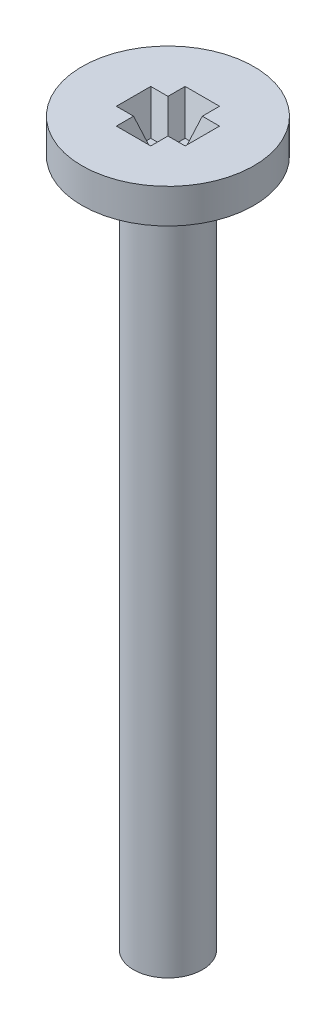
ISO-10303-21;
HEADER;
FILE_DESCRIPTION(('STEP AP214'),'2;1');
FILE_NAME('part.step','',(''),(''),'','','');
FILE_SCHEMA(('AUTOMOTIVE_DESIGN { 1 0 10303 214 1 1 1 1 }'));
ENDSEC;
DATA;
#1=APPLICATION_CONTEXT('core data for automotive mechanical design processes');
#2=APPLICATION_PROTOCOL_DEFINITION('international standard','automotive_design',2000,#1);
#3=PRODUCT_CONTEXT('',#1,'mechanical');
#4=PRODUCT('Part','Part','',(#3));
#5=PRODUCT_RELATED_PRODUCT_CATEGORY('part','',(#4));
#6=PRODUCT_DEFINITION_FORMATION('','',#4);
#7=PRODUCT_DEFINITION_CONTEXT('part definition',#1,'design');
#8=PRODUCT_DEFINITION('design','',#6,#7);
#9=PRODUCT_DEFINITION_SHAPE('','',#8);
#10=(LENGTH_UNIT() NAMED_UNIT(*) SI_UNIT(.MILLI.,.METRE.));
#11=(NAMED_UNIT(*) PLANE_ANGLE_UNIT() SI_UNIT($,.RADIAN.));
#12=(NAMED_UNIT(*) SI_UNIT($,.STERADIAN.) SOLID_ANGLE_UNIT());
#13=UNCERTAINTY_MEASURE_WITH_UNIT(LENGTH_MEASURE(1.E-05),#10,'distance_accuracy_value','');
#14=(GEOMETRIC_REPRESENTATION_CONTEXT(3) GLOBAL_UNCERTAINTY_ASSIGNED_CONTEXT((#13)) GLOBAL_UNIT_ASSIGNED_CONTEXT((#10,
#11,#12)) REPRESENTATION_CONTEXT('',''));
#15=CARTESIAN_POINT('',(0.,0.,0.));
#16=DIRECTION('',(0.,0.,1.));
#17=DIRECTION('',(1.,0.,0.));
#18=AXIS2_PLACEMENT_3D('',#15,#16,#17);
#19=CARTESIAN_POINT('',(0.,0.,0.));
#20=DIRECTION('',(0.,1.,0.));
#21=DIRECTION('',(0.,0.,1.));
#22=AXIS2_PLACEMENT_3D('',#19,#20,#21);
#23=PLANE('',#22);
#24=CARTESIAN_POINT('',(0.,0.,0.));
#25=DIRECTION('',(0.,1.,0.));
#26=DIRECTION('',(0.,0.,1.));
#27=AXIS2_PLACEMENT_3D('',#24,#25,#26);
#28=CIRCLE('',#27,5.);
#29=CARTESIAN_POINT('',(0.,0.,5.));
#30=VERTEX_POINT('',#29);
#31=EDGE_CURVE('E203',#30,#30,#28,.T.);
#32=ORIENTED_EDGE('',*,*,#31,.F.);
#33=EDGE_LOOP('',(#32));
#34=FACE_BOUND('',#33,.T.);
#35=CARTESIAN_POINT('',(0.,0.,0.));
#36=DIRECTION('',(0.,1.,0.));
#37=DIRECTION('',(0.,0.,1.));
#38=AXIS2_PLACEMENT_3D('',#35,#36,#37);
#39=CIRCLE('',#38,2.);
#40=CARTESIAN_POINT('',(0.,0.,2.));
#41=VERTEX_POINT('',#40);
#42=EDGE_CURVE('E12',#41,#41,#39,.F.);
#43=ORIENTED_EDGE('',*,*,#42,.F.);
#44=EDGE_LOOP('',(#43));
#45=FACE_BOUND('',#44,.T.);
#46=ADVANCED_FACE('F57',(#34,#45),#23,.F.);
#47=CARTESIAN_POINT('',(0.,2.,0.));
#48=DIRECTION('',(0.,-1.,0.));
#49=DIRECTION('',(0.,0.,-1.));
#50=AXIS2_PLACEMENT_3D('',#47,#48,#49);
#51=CYLINDRICAL_SURFACE('',#50,5.);
#52=CARTESIAN_POINT('',(0.,2.,0.));
#53=DIRECTION('',(0.,1.,0.));
#54=DIRECTION('',(0.,0.,1.));
#55=AXIS2_PLACEMENT_3D('',#52,#53,#54);
#56=CIRCLE('',#55,5.);
#57=CARTESIAN_POINT('',(0.,2.,5.));
#58=VERTEX_POINT('',#57);
#59=EDGE_CURVE('E65',#58,#58,#56,.T.);
#60=ORIENTED_EDGE('',*,*,#59,.F.);
#61=EDGE_LOOP('',(#60));
#62=FACE_BOUND('',#61,.T.);
#63=ORIENTED_EDGE('',*,*,#31,.T.);
#64=EDGE_LOOP('',(#63));
#65=FACE_BOUND('',#64,.T.);
#66=ADVANCED_FACE('F59',(#62,#65),#51,.T.);
#67=CARTESIAN_POINT('',(0.,2.,0.));
#68=DIRECTION('',(0.,1.,0.));
#69=DIRECTION('',(0.,0.,1.));
#70=AXIS2_PLACEMENT_3D('',#67,#68,#69);
#71=PLANE('',#70);
#72=DIRECTION('',(1.,0.,0.));
#73=VECTOR('',#72,1.);
#74=CARTESIAN_POINT('',(-2.,2.,1.));
#75=LINE('',#74,#73);
#76=CARTESIAN_POINT('',(-2.,2.,1.));
#77=VERTEX_POINT('',#76);
#78=CARTESIAN_POINT('',(-1.,2.,1.));
#79=VERTEX_POINT('',#78);
#80=EDGE_CURVE('E288',#77,#79,#75,.T.);
#81=ORIENTED_EDGE('',*,*,#80,.F.);
#82=DIRECTION('',(0.,0.,-1.));
#83=VECTOR('',#82,1.);
#84=CARTESIAN_POINT('',(-2.,2.,1.));
#85=LINE('',#84,#83);
#86=CARTESIAN_POINT('',(-2.,2.,-1.));
#87=VERTEX_POINT('',#86);
#88=EDGE_CURVE('E292',#77,#87,#85,.T.);
#89=ORIENTED_EDGE('',*,*,#88,.T.);
#90=DIRECTION('',(1.,0.,0.));
#91=VECTOR('',#90,1.);
#92=CARTESIAN_POINT('',(-2.,2.,-1.));
#93=LINE('',#92,#91);
#94=CARTESIAN_POINT('',(-1.,2.,-1.));
#95=VERTEX_POINT('',#94);
#96=EDGE_CURVE('E301',#87,#95,#93,.T.);
#97=ORIENTED_EDGE('',*,*,#96,.T.);
#98=DIRECTION('',(0.,0.,-1.));
#99=VECTOR('',#98,1.);
#100=CARTESIAN_POINT('',(-1.,2.,2.));
#101=LINE('',#100,#99);
#102=CARTESIAN_POINT('',(-1.,2.,-2.));
#103=VERTEX_POINT('',#102);
#104=EDGE_CURVE('E193',#95,#103,#101,.T.);
#105=ORIENTED_EDGE('',*,*,#104,.T.);
#106=DIRECTION('',(1.,0.,0.));
#107=VECTOR('',#106,1.);
#108=CARTESIAN_POINT('',(-1.,2.,-2.));
#109=LINE('',#108,#107);
#110=CARTESIAN_POINT('',(1.,2.,-2.));
#111=VERTEX_POINT('',#110);
#112=EDGE_CURVE('E190',#103,#111,#109,.T.);
#113=ORIENTED_EDGE('',*,*,#112,.T.);
#114=DIRECTION('',(0.,0.,-1.));
#115=VECTOR('',#114,1.);
#116=CARTESIAN_POINT('',(1.,2.,2.));
#117=LINE('',#116,#115);
#118=CARTESIAN_POINT('',(1.,2.,-1.));
#119=VERTEX_POINT('',#118);
#120=EDGE_CURVE('E186',#119,#111,#117,.T.);
#121=ORIENTED_EDGE('',*,*,#120,.F.);
#122=CARTESIAN_POINT('',(2.,2.,-1.));
#123=VERTEX_POINT('',#122);
#124=EDGE_CURVE('E296',#119,#123,#93,.T.);
#125=ORIENTED_EDGE('',*,*,#124,.T.);
#126=DIRECTION('',(0.,0.,1.));
#127=VECTOR('',#126,1.);
#128=CARTESIAN_POINT('',(2.,2.,-1.));
#129=LINE('',#128,#127);
#130=CARTESIAN_POINT('',(2.,2.,1.));
#131=VERTEX_POINT('',#130);
#132=EDGE_CURVE('E161',#123,#131,#129,.T.);
#133=ORIENTED_EDGE('',*,*,#132,.T.);
#134=CARTESIAN_POINT('',(1.,2.,1.));
#135=VERTEX_POINT('',#134);
#136=EDGE_CURVE('E294',#135,#131,#75,.T.);
#137=ORIENTED_EDGE('',*,*,#136,.F.);
#138=CARTESIAN_POINT('',(1.,2.,2.));
#139=VERTEX_POINT('',#138);
#140=EDGE_CURVE('E187',#139,#135,#117,.T.);
#141=ORIENTED_EDGE('',*,*,#140,.F.);
#142=DIRECTION('',(-1.,0.,0.));
#143=VECTOR('',#142,1.);
#144=CARTESIAN_POINT('',(1.,2.,2.));
#145=LINE('',#144,#143);
#146=CARTESIAN_POINT('',(-1.,2.,2.));
#147=VERTEX_POINT('',#146);
#148=EDGE_CURVE('E197',#139,#147,#145,.T.);
#149=ORIENTED_EDGE('',*,*,#148,.T.);
#150=EDGE_CURVE('E194',#147,#79,#101,.T.);
#151=ORIENTED_EDGE('',*,*,#150,.T.);
#152=EDGE_LOOP('',(#81,#89,#97,#105,#113,#121,#125,#133,#137,#141,#149,#151));
#153=FACE_BOUND('',#152,.T.);
#154=ORIENTED_EDGE('',*,*,#59,.T.);
#155=EDGE_LOOP('',(#154));
#156=FACE_BOUND('',#155,.T.);
#157=ADVANCED_FACE('F276',(#153,#156),#71,.T.);
#158=CARTESIAN_POINT('',(1.,2.,2.));
#159=DIRECTION('',(0.956304755963035,-0.292371704722737,0.));
#160=DIRECTION('',(0.292371704722737,0.956304755963035,0.));
#161=AXIS2_PLACEMENT_3D('',#158,#159,#160);
#162=PLANE('',#161);
#163=ORIENTED_EDGE('',*,*,#120,.T.);
#164=DIRECTION('',(-0.280623595142128,-0.917878420979061,0.280623595142128));
#165=VECTOR('',#164,1.);
#166=CARTESIAN_POINT('',(0.842500795699015,1.48484331520295,-1.84250079569901));
#167=LINE('',#166,#165);
#168=CARTESIAN_POINT('',(0.388538637082679,0.,-1.38853863708268));
#169=VERTEX_POINT('',#168);
#170=EDGE_CURVE('E205',#169,#111,#167,.F.);
#171=ORIENTED_EDGE('',*,*,#170,.F.);
#172=DIRECTION('',(0.,0.,-1.));
#173=VECTOR('',#172,1.);
#174=CARTESIAN_POINT('',(0.388538637082679,0.,2.));
#175=LINE('',#174,#173);
#176=CARTESIAN_POINT('',(0.388538637082678,0.,-0.388538637082679));
#177=VERTEX_POINT('',#176);
#178=EDGE_CURVE('E200',#177,#169,#175,.T.);
#179=ORIENTED_EDGE('',*,*,#178,.F.);
#180=DIRECTION('',(0.280623595142128,0.917878420979061,-0.280623595142128));
#181=VECTOR('',#180,1.);
#182=CARTESIAN_POINT('',(0.763751193548522,1.22726497280443,-0.763751193548522));
#183=LINE('',#182,#181);
#184=EDGE_CURVE('E168',#119,#177,#183,.F.);
#185=ORIENTED_EDGE('',*,*,#184,.F.);
#186=EDGE_LOOP('',(#163,#171,#179,#185));
#187=FACE_BOUND('',#186,.T.);
#188=ADVANCED_FACE('F266',(#187),#162,.F.);
#189=CARTESIAN_POINT('',(-1.,2.,2.));
#190=DIRECTION('',(-0.956304755963035,-0.292371704722737,0.));
#191=DIRECTION('',(0.292371704722737,-0.956304755963035,0.));
#192=AXIS2_PLACEMENT_3D('',#189,#190,#191);
#193=PLANE('',#192);
#194=DIRECTION('',(0.280623595142128,-0.917878420979061,0.280623595142128));
#195=VECTOR('',#194,1.);
#196=CARTESIAN_POINT('',(-0.763751193548522,1.22726497280443,-0.763751193548522));
#197=LINE('',#196,#195);
#198=CARTESIAN_POINT('',(-0.388538637082679,0.,-0.388538637082678));
#199=VERTEX_POINT('',#198);
#200=EDGE_CURVE('E177',#95,#199,#197,.T.);
#201=ORIENTED_EDGE('',*,*,#200,.T.);
#202=DIRECTION('',(0.,0.,1.));
#203=VECTOR('',#202,1.);
#204=CARTESIAN_POINT('',(-0.388538637082679,0.,2.));
#205=LINE('',#204,#203);
#206=CARTESIAN_POINT('',(-0.388538637082679,0.,-1.38853863708268));
#207=VERTEX_POINT('',#206);
#208=EDGE_CURVE('E219',#199,#207,#205,.F.);
#209=ORIENTED_EDGE('',*,*,#208,.T.);
#210=DIRECTION('',(-0.280623595142128,0.917878420979061,-0.280623595142128));
#211=VECTOR('',#210,1.);
#212=CARTESIAN_POINT('',(-1.,2.,-2.));
#213=LINE('',#212,#211);
#214=EDGE_CURVE('E208',#207,#103,#213,.T.);
#215=ORIENTED_EDGE('',*,*,#214,.T.);
#216=ORIENTED_EDGE('',*,*,#104,.F.);
#217=EDGE_LOOP('',(#201,#209,#215,#216));
#218=FACE_BOUND('',#217,.T.);
#219=ADVANCED_FACE('F264',(#218),#193,.F.);
#220=DIRECTION('',(-0.280623595142128,-0.917878420979061,-0.280623595142128));
#221=VECTOR('',#220,1.);
#222=CARTESIAN_POINT('',(1.07874960215049,2.25757834239852,1.07874960215049));
#223=LINE('',#222,#221);
#224=CARTESIAN_POINT('',(0.388538637082678,0.,0.388538637082679));
#225=VERTEX_POINT('',#224);
#226=EDGE_CURVE('E183',#135,#225,#223,.T.);
#227=ORIENTED_EDGE('',*,*,#226,.T.);
#228=CARTESIAN_POINT('',(0.388538637082679,0.,1.38853863708268));
#229=VERTEX_POINT('',#228);
#230=EDGE_CURVE('E212',#229,#225,#175,.T.);
#231=ORIENTED_EDGE('',*,*,#230,.F.);
#232=DIRECTION('',(-0.280623595142128,-0.917878420979061,-0.280623595142128));
#233=VECTOR('',#232,1.);
#234=CARTESIAN_POINT('',(1.,2.,2.));
#235=LINE('',#234,#233);
#236=EDGE_CURVE('E201',#229,#139,#235,.F.);
#237=ORIENTED_EDGE('',*,*,#236,.T.);
#238=ORIENTED_EDGE('',*,*,#140,.T.);
#239=EDGE_LOOP('',(#227,#231,#237,#238));
#240=FACE_BOUND('',#239,.T.);
#241=ADVANCED_FACE('F260',(#240),#162,.F.);
#242=CARTESIAN_POINT('',(1.,2.,2.));
#243=DIRECTION('',(0.,-0.292371704722737,0.956304755963035));
#244=DIRECTION('',(0.,-0.956304755963035,-0.292371704722737));
#245=AXIS2_PLACEMENT_3D('',#242,#243,#244);
#246=PLANE('',#245);
#247=ORIENTED_EDGE('',*,*,#148,.F.);
#248=ORIENTED_EDGE('',*,*,#236,.F.);
#249=DIRECTION('',(1.,0.,0.));
#250=VECTOR('',#249,1.);
#251=CARTESIAN_POINT('',(1.,0.,1.38853863708268));
#252=LINE('',#251,#250);
#253=CARTESIAN_POINT('',(-0.388538637082679,0.,1.38853863708268));
#254=VERTEX_POINT('',#253);
#255=EDGE_CURVE('E209',#229,#254,#252,.F.);
#256=ORIENTED_EDGE('',*,*,#255,.T.);
#257=DIRECTION('',(-0.280623595142128,0.917878420979061,0.280623595142128));
#258=VECTOR('',#257,1.);
#259=CARTESIAN_POINT('',(-1.,2.,2.));
#260=LINE('',#259,#258);
#261=EDGE_CURVE('E204',#254,#147,#260,.T.);
#262=ORIENTED_EDGE('',*,*,#261,.T.);
#263=EDGE_LOOP('',(#247,#248,#256,#262));
#264=FACE_BOUND('',#263,.T.);
#265=ADVANCED_FACE('F263',(#264),#246,.F.);
#266=ORIENTED_EDGE('',*,*,#150,.F.);
#267=ORIENTED_EDGE('',*,*,#261,.F.);
#268=CARTESIAN_POINT('',(-0.388538637082679,0.,0.388538637082679));
#269=VERTEX_POINT('',#268);
#270=EDGE_CURVE('E217',#254,#269,#205,.F.);
#271=ORIENTED_EDGE('',*,*,#270,.T.);
#272=DIRECTION('',(-0.280623595142128,0.917878420979061,0.280623595142128));
#273=VECTOR('',#272,1.);
#274=CARTESIAN_POINT('',(-1.07874960215049,2.25757834239852,1.07874960215049));
#275=LINE('',#274,#273);
#276=EDGE_CURVE('E80',#79,#269,#275,.F.);
#277=ORIENTED_EDGE('',*,*,#276,.F.);
#278=EDGE_LOOP('',(#266,#267,#271,#277));
#279=FACE_BOUND('',#278,.T.);
#280=ADVANCED_FACE('F269',(#279),#193,.F.);
#281=CARTESIAN_POINT('',(-1.,2.,-2.));
#282=DIRECTION('',(0.,-0.292371704722737,-0.956304755963035));
#283=DIRECTION('',(0.,0.956304755963035,-0.292371704722737));
#284=AXIS2_PLACEMENT_3D('',#281,#282,#283);
#285=PLANE('',#284);
#286=ORIENTED_EDGE('',*,*,#112,.F.);
#287=ORIENTED_EDGE('',*,*,#214,.F.);
#288=DIRECTION('',(-1.,0.,0.));
#289=VECTOR('',#288,1.);
#290=CARTESIAN_POINT('',(-1.,0.,-1.38853863708268));
#291=LINE('',#290,#289);
#292=EDGE_CURVE('E214',#207,#169,#291,.F.);
#293=ORIENTED_EDGE('',*,*,#292,.T.);
#294=ORIENTED_EDGE('',*,*,#170,.T.);
#295=EDGE_LOOP('',(#286,#287,#293,#294));
#296=FACE_BOUND('',#295,.T.);
#297=ADVANCED_FACE('F258',(#296),#285,.F.);
#298=CARTESIAN_POINT('',(-2.,2.,1.));
#299=DIRECTION('',(-0.956304755963035,-0.292371704722737,0.));
#300=DIRECTION('',(0.292371704722737,-0.956304755963035,0.));
#301=AXIS2_PLACEMENT_3D('',#298,#299,#300);
#302=PLANE('',#301);
#303=ORIENTED_EDGE('',*,*,#88,.F.);
#304=DIRECTION('',(0.280623595142128,-0.917878420979061,-0.280623595142128));
#305=VECTOR('',#304,1.);
#306=CARTESIAN_POINT('',(-2.,2.,1.));
#307=LINE('',#306,#305);
#308=CARTESIAN_POINT('',(-1.38853863708268,0.,0.388538637082679));
#309=VERTEX_POINT('',#308);
#310=EDGE_CURVE('E180',#309,#77,#307,.F.);
#311=ORIENTED_EDGE('',*,*,#310,.F.);
#312=DIRECTION('',(0.,0.,1.));
#313=VECTOR('',#312,1.);
#314=CARTESIAN_POINT('',(-1.38853863708268,0.,1.));
#315=LINE('',#314,#313);
#316=CARTESIAN_POINT('',(-1.38853863708268,0.,-0.388538637082679));
#317=VERTEX_POINT('',#316);
#318=EDGE_CURVE('E173',#309,#317,#315,.F.);
#319=ORIENTED_EDGE('',*,*,#318,.T.);
#320=DIRECTION('',(-0.280623595142128,0.917878420979061,-0.280623595142128));
#321=VECTOR('',#320,1.);
#322=CARTESIAN_POINT('',(-2.,2.,-1.));
#323=LINE('',#322,#321);
#324=EDGE_CURVE('E164',#317,#87,#323,.T.);
#325=ORIENTED_EDGE('',*,*,#324,.T.);
#326=EDGE_LOOP('',(#303,#311,#319,#325));
#327=FACE_BOUND('',#326,.T.);
#328=ADVANCED_FACE('F255',(#327),#302,.F.);
#329=CARTESIAN_POINT('',(-2.,2.,-1.));
#330=DIRECTION('',(0.,-0.292371704722737,-0.956304755963035));
#331=DIRECTION('',(0.,0.956304755963035,-0.292371704722737));
#332=AXIS2_PLACEMENT_3D('',#329,#330,#331);
#333=PLANE('',#332);
#334=ORIENTED_EDGE('',*,*,#96,.F.);
#335=ORIENTED_EDGE('',*,*,#324,.F.);
#336=DIRECTION('',(-1.,0.,0.));
#337=VECTOR('',#336,1.);
#338=CARTESIAN_POINT('',(-2.,0.,-0.388538637082679));
#339=LINE('',#338,#337);
#340=EDGE_CURVE('E170',#317,#199,#339,.F.);
#341=ORIENTED_EDGE('',*,*,#340,.T.);
#342=ORIENTED_EDGE('',*,*,#200,.F.);
#343=EDGE_LOOP('',(#334,#335,#341,#342));
#344=FACE_BOUND('',#343,.T.);
#345=ADVANCED_FACE('F254',(#344),#333,.F.);
#346=CARTESIAN_POINT('',(-2.,2.,1.));
#347=DIRECTION('',(0.,-0.292371704722737,0.956304755963035));
#348=DIRECTION('',(0.,-0.956304755963035,-0.292371704722737));
#349=AXIS2_PLACEMENT_3D('',#346,#347,#348);
#350=PLANE('',#349);
#351=ORIENTED_EDGE('',*,*,#276,.T.);
#352=DIRECTION('',(1.,0.,0.));
#353=VECTOR('',#352,1.);
#354=CARTESIAN_POINT('',(-2.,0.,0.388538637082679));
#355=LINE('',#354,#353);
#356=EDGE_CURVE('E156',#309,#269,#355,.T.);
#357=ORIENTED_EDGE('',*,*,#356,.F.);
#358=ORIENTED_EDGE('',*,*,#310,.T.);
#359=ORIENTED_EDGE('',*,*,#80,.T.);
#360=EDGE_LOOP('',(#351,#357,#358,#359));
#361=FACE_BOUND('',#360,.T.);
#362=ADVANCED_FACE('F248',(#361),#350,.F.);
#363=ORIENTED_EDGE('',*,*,#136,.T.);
#364=DIRECTION('',(-0.280623595142128,-0.917878420979061,-0.280623595142128));
#365=VECTOR('',#364,1.);
#366=CARTESIAN_POINT('',(1.84250079569901,1.48484331520295,0.842500795699015));
#367=LINE('',#366,#365);
#368=CARTESIAN_POINT('',(1.38853863708268,0.,0.388538637082679));
#369=VERTEX_POINT('',#368);
#370=EDGE_CURVE('E72',#369,#131,#367,.F.);
#371=ORIENTED_EDGE('',*,*,#370,.F.);
#372=EDGE_CURVE('E155',#225,#369,#355,.T.);
#373=ORIENTED_EDGE('',*,*,#372,.F.);
#374=ORIENTED_EDGE('',*,*,#226,.F.);
#375=EDGE_LOOP('',(#363,#371,#373,#374));
#376=FACE_BOUND('',#375,.T.);
#377=ADVANCED_FACE('F245',(#376),#350,.F.);
#378=ORIENTED_EDGE('',*,*,#184,.T.);
#379=CARTESIAN_POINT('',(1.38853863708268,0.,-0.388538637082679));
#380=VERTEX_POINT('',#379);
#381=EDGE_CURVE('E152',#177,#380,#339,.F.);
#382=ORIENTED_EDGE('',*,*,#381,.T.);
#383=DIRECTION('',(0.280623595142128,0.917878420979061,-0.280623595142128));
#384=VECTOR('',#383,1.);
#385=CARTESIAN_POINT('',(2.,2.,-1.));
#386=LINE('',#385,#384);
#387=EDGE_CURVE('E158',#380,#123,#386,.T.);
#388=ORIENTED_EDGE('',*,*,#387,.T.);
#389=ORIENTED_EDGE('',*,*,#124,.F.);
#390=EDGE_LOOP('',(#378,#382,#388,#389));
#391=FACE_BOUND('',#390,.T.);
#392=ADVANCED_FACE('F166',(#391),#333,.F.);
#393=CARTESIAN_POINT('',(2.,2.,-1.));
#394=DIRECTION('',(0.956304755963035,-0.292371704722737,0.));
#395=DIRECTION('',(0.292371704722737,0.956304755963035,0.));
#396=AXIS2_PLACEMENT_3D('',#393,#394,#395);
#397=PLANE('',#396);
#398=ORIENTED_EDGE('',*,*,#132,.F.);
#399=ORIENTED_EDGE('',*,*,#387,.F.);
#400=DIRECTION('',(0.,0.,-1.));
#401=VECTOR('',#400,1.);
#402=CARTESIAN_POINT('',(1.38853863708268,0.,-1.));
#403=LINE('',#402,#401);
#404=EDGE_CURVE('E148',#380,#369,#403,.F.);
#405=ORIENTED_EDGE('',*,*,#404,.T.);
#406=ORIENTED_EDGE('',*,*,#370,.T.);
#407=EDGE_LOOP('',(#398,#399,#405,#406));
#408=FACE_BOUND('',#407,.T.);
#409=ADVANCED_FACE('F159',(#408),#397,.F.);
#410=CARTESIAN_POINT('',(0.,0.,0.));
#411=DIRECTION('',(0.,-1.,0.));
#412=DIRECTION('',(0.,0.,-1.));
#413=AXIS2_PLACEMENT_3D('',#410,#411,#412);
#414=PLANE('',#413);
#415=ORIENTED_EDGE('',*,*,#318,.F.);
#416=ORIENTED_EDGE('',*,*,#356,.T.);
#417=ORIENTED_EDGE('',*,*,#270,.F.);
#418=ORIENTED_EDGE('',*,*,#255,.F.);
#419=ORIENTED_EDGE('',*,*,#230,.T.);
#420=ORIENTED_EDGE('',*,*,#372,.T.);
#421=ORIENTED_EDGE('',*,*,#404,.F.);
#422=ORIENTED_EDGE('',*,*,#381,.F.);
#423=ORIENTED_EDGE('',*,*,#178,.T.);
#424=ORIENTED_EDGE('',*,*,#292,.F.);
#425=ORIENTED_EDGE('',*,*,#208,.F.);
#426=ORIENTED_EDGE('',*,*,#340,.F.);
#427=EDGE_LOOP('',(#415,#416,#417,#418,#419,#420,#421,#422,#423,#424,#425,#426));
#428=FACE_BOUND('',#427,.T.);
#429=ADVANCED_FACE('F150',(#428),#414,.F.);
#430=CARTESIAN_POINT('',(0.,-40.,0.));
#431=DIRECTION('',(0.,1.,0.));
#432=DIRECTION('',(0.,0.,1.));
#433=AXIS2_PLACEMENT_3D('',#430,#431,#432);
#434=CYLINDRICAL_SURFACE('',#433,2.);
#435=CARTESIAN_POINT('',(0.,-40.,0.));
#436=DIRECTION('',(0.,-1.,0.));
#437=DIRECTION('',(0.,0.,-1.));
#438=AXIS2_PLACEMENT_3D('',#435,#436,#437);
#439=CIRCLE('',#438,2.);
#440=CARTESIAN_POINT('',(0.,-40.,-2.));
#441=VERTEX_POINT('',#440);
#442=EDGE_CURVE('E298',#441,#441,#439,.T.);
#443=ORIENTED_EDGE('',*,*,#442,.F.);
#444=EDGE_LOOP('',(#443));
#445=FACE_BOUND('',#444,.T.);
#446=ORIENTED_EDGE('',*,*,#42,.T.);
#447=EDGE_LOOP('',(#446));
#448=FACE_BOUND('',#447,.T.);
#449=ADVANCED_FACE('F231',(#445,#448),#434,.T.);
#450=CARTESIAN_POINT('',(0.,-40.,0.));
#451=DIRECTION('',(0.,-1.,0.));
#452=DIRECTION('',(0.,0.,-1.));
#453=AXIS2_PLACEMENT_3D('',#450,#451,#452);
#454=PLANE('',#453);
#455=ORIENTED_EDGE('',*,*,#442,.T.);
#456=EDGE_LOOP('',(#455));
#457=FACE_BOUND('',#456,.T.);
#458=ADVANCED_FACE('F233',(#457),#454,.T.);
#459=CLOSED_SHELL('',(#46,#66,#157,#188,#219,#241,#265,#280,#297,#328,#345,#362,#377,#392,#409,
#429,#449,#458));
#460=MANIFOLD_SOLID_BREP('B2',#459);
#461=ADVANCED_BREP_SHAPE_REPRESENTATION('',(#18,#460),#14);
#462=SHAPE_DEFINITION_REPRESENTATION(#9,#461);
ENDSEC;
END-ISO-10303-21;
